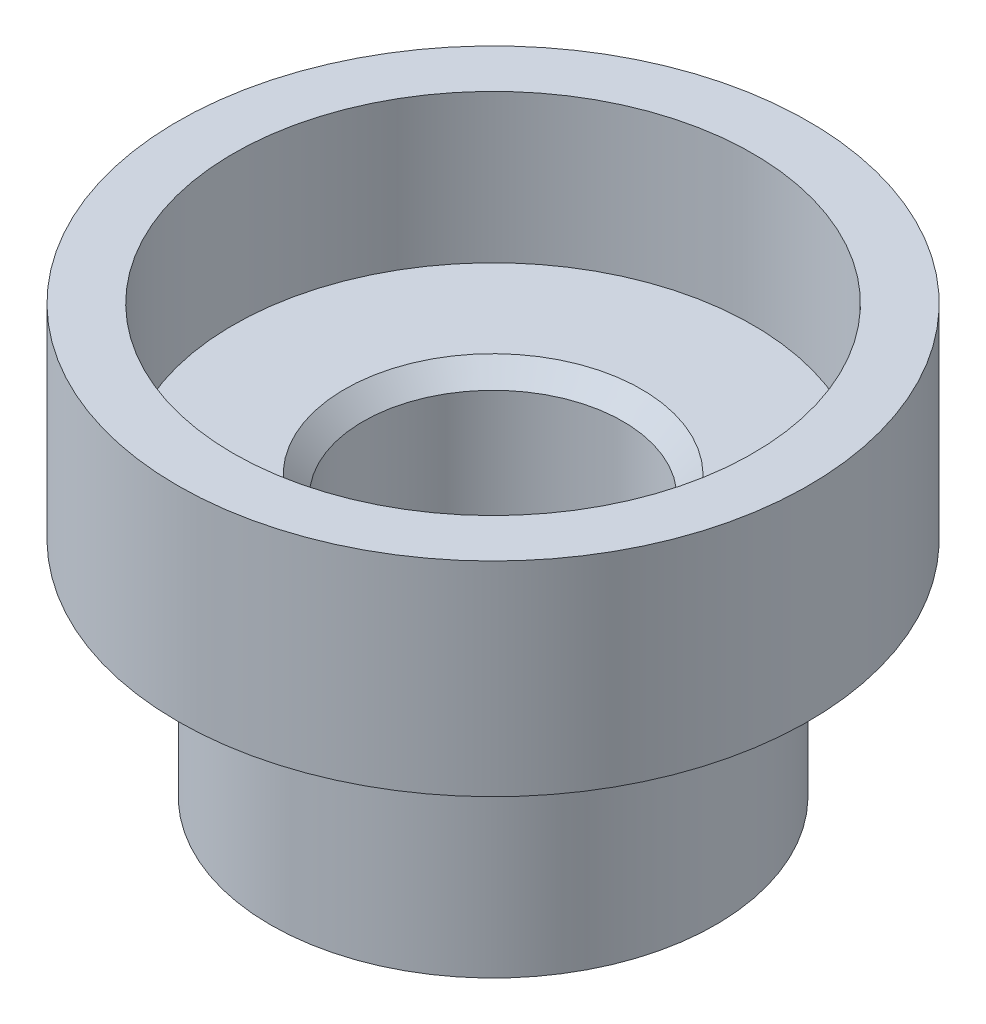
ISO-10303-21;
HEADER;
FILE_DESCRIPTION(('STEP AP214'),'2;1');
FILE_NAME('part.step','',(''),(''),'','','');
FILE_SCHEMA(('AUTOMOTIVE_DESIGN { 1 0 10303 214 1 1 1 1 }'));
ENDSEC;
DATA;
#1=APPLICATION_CONTEXT('core data for automotive mechanical design processes');
#2=APPLICATION_PROTOCOL_DEFINITION('international standard','automotive_design',2000,#1);
#3=PRODUCT_CONTEXT('',#1,'mechanical');
#4=PRODUCT('Part','Part','',(#3));
#5=PRODUCT_RELATED_PRODUCT_CATEGORY('part','',(#4));
#6=PRODUCT_DEFINITION_FORMATION('','',#4);
#7=PRODUCT_DEFINITION_CONTEXT('part definition',#1,'design');
#8=PRODUCT_DEFINITION('design','',#6,#7);
#9=PRODUCT_DEFINITION_SHAPE('','',#8);
#10=(LENGTH_UNIT() NAMED_UNIT(*) SI_UNIT(.MILLI.,.METRE.));
#11=(NAMED_UNIT(*) PLANE_ANGLE_UNIT() SI_UNIT($,.RADIAN.));
#12=(NAMED_UNIT(*) SI_UNIT($,.STERADIAN.) SOLID_ANGLE_UNIT());
#13=UNCERTAINTY_MEASURE_WITH_UNIT(LENGTH_MEASURE(1.E-05),#10,'distance_accuracy_value','');
#14=(GEOMETRIC_REPRESENTATION_CONTEXT(3) GLOBAL_UNCERTAINTY_ASSIGNED_CONTEXT((#13)) GLOBAL_UNIT_ASSIGNED_CONTEXT((#10,
#11,#12)) REPRESENTATION_CONTEXT('',''));
#15=CARTESIAN_POINT('',(0.,0.,0.));
#16=DIRECTION('',(0.,0.,1.));
#17=DIRECTION('',(1.,0.,0.));
#18=AXIS2_PLACEMENT_3D('',#15,#16,#17);
#19=CARTESIAN_POINT('',(0.,-4.6,0.));
#20=DIRECTION('',(0.,1.,0.));
#21=DIRECTION('',(0.,0.,1.));
#22=AXIS2_PLACEMENT_3D('',#19,#20,#21);
#23=CYLINDRICAL_SURFACE('',#22,2.4);
#24=CARTESIAN_POINT('',(0.,-4.6,0.));
#25=DIRECTION('',(0.,1.,0.));
#26=DIRECTION('',(0.,0.,1.));
#27=AXIS2_PLACEMENT_3D('',#24,#25,#26);
#28=CIRCLE('',#27,2.4);
#29=CARTESIAN_POINT('',(0.,-4.6,2.4));
#30=VERTEX_POINT('',#29);
#31=EDGE_CURVE('E85',#30,#30,#28,.T.);
#32=ORIENTED_EDGE('',*,*,#31,.T.);
#33=EDGE_LOOP('',(#32));
#34=FACE_BOUND('',#33,.T.);
#35=CARTESIAN_POINT('',(0.,-2.4,0.));
#36=DIRECTION('',(0.,1.,0.));
#37=DIRECTION('',(0.,0.,1.));
#38=AXIS2_PLACEMENT_3D('',#35,#36,#37);
#39=CIRCLE('',#38,2.4);
#40=CARTESIAN_POINT('',(0.,-2.4,2.4));
#41=VERTEX_POINT('',#40);
#42=EDGE_CURVE('E10',#41,#41,#39,.T.);
#43=ORIENTED_EDGE('',*,*,#42,.F.);
#44=EDGE_LOOP('',(#43));
#45=FACE_BOUND('',#44,.T.);
#46=ADVANCED_FACE('F40',(#34,#45),#23,.T.);
#47=CARTESIAN_POINT('',(0.,-2.4,0.));
#48=DIRECTION('',(0.,1.,0.));
#49=DIRECTION('',(0.,0.,1.));
#50=AXIS2_PLACEMENT_3D('',#47,#48,#49);
#51=TOROIDAL_SURFACE('',#50,2.6,0.2);
#52=ORIENTED_EDGE('',*,*,#42,.T.);
#53=EDGE_LOOP('',(#52));
#54=FACE_BOUND('',#53,.T.);
#55=CARTESIAN_POINT('',(0.,-2.2,0.));
#56=DIRECTION('',(0.,1.,0.));
#57=DIRECTION('',(0.,0.,1.));
#58=AXIS2_PLACEMENT_3D('',#55,#56,#57);
#59=CIRCLE('',#58,2.6);
#60=CARTESIAN_POINT('',(0.,-2.2,2.6));
#61=VERTEX_POINT('',#60);
#62=EDGE_CURVE('E47',#61,#61,#59,.T.);
#63=ORIENTED_EDGE('',*,*,#62,.F.);
#64=EDGE_LOOP('',(#63));
#65=FACE_BOUND('',#64,.T.);
#66=ADVANCED_FACE('F105',(#54,#65),#51,.F.);
#67=CARTESIAN_POINT('',(3.4,-2.2,0.));
#68=DIRECTION('',(0.,-1.,0.));
#69=DIRECTION('',(0.,0.,-1.));
#70=AXIS2_PLACEMENT_3D('',#67,#68,#69);
#71=PLANE('',#70);
#72=ORIENTED_EDGE('',*,*,#62,.T.);
#73=EDGE_LOOP('',(#72));
#74=FACE_BOUND('',#73,.T.);
#75=CARTESIAN_POINT('',(0.,-2.2,0.));
#76=DIRECTION('',(0.,1.,0.));
#77=DIRECTION('',(0.,0.,1.));
#78=AXIS2_PLACEMENT_3D('',#75,#76,#77);
#79=CIRCLE('',#78,3.4);
#80=CARTESIAN_POINT('',(0.,-2.2,3.4));
#81=VERTEX_POINT('',#80);
#82=EDGE_CURVE('E55',#81,#81,#79,.T.);
#83=ORIENTED_EDGE('',*,*,#82,.F.);
#84=EDGE_LOOP('',(#83));
#85=FACE_BOUND('',#84,.T.);
#86=ADVANCED_FACE('F109',(#74,#85),#71,.T.);
#87=CARTESIAN_POINT('',(0.,-4.6,0.));
#88=DIRECTION('',(0.,1.,0.));
#89=DIRECTION('',(0.,0.,1.));
#90=AXIS2_PLACEMENT_3D('',#87,#88,#89);
#91=CYLINDRICAL_SURFACE('',#90,3.4);
#92=ORIENTED_EDGE('',*,*,#82,.T.);
#93=EDGE_LOOP('',(#92));
#94=FACE_BOUND('',#93,.T.);
#95=CARTESIAN_POINT('',(0.,0.,0.));
#96=DIRECTION('',(0.,1.,0.));
#97=DIRECTION('',(0.,0.,1.));
#98=AXIS2_PLACEMENT_3D('',#95,#96,#97);
#99=CIRCLE('',#98,3.4);
#100=CARTESIAN_POINT('',(0.,0.,3.4));
#101=VERTEX_POINT('',#100);
#102=EDGE_CURVE('E62',#101,#101,#99,.T.);
#103=ORIENTED_EDGE('',*,*,#102,.F.);
#104=EDGE_LOOP('',(#103));
#105=FACE_BOUND('',#104,.T.);
#106=ADVANCED_FACE('F113',(#94,#105),#91,.T.);
#107=CARTESIAN_POINT('',(2.8,0.,0.));
#108=DIRECTION('',(0.,1.,0.));
#109=DIRECTION('',(0.,0.,1.));
#110=AXIS2_PLACEMENT_3D('',#107,#108,#109);
#111=PLANE('',#110);
#112=ORIENTED_EDGE('',*,*,#102,.T.);
#113=EDGE_LOOP('',(#112));
#114=FACE_BOUND('',#113,.T.);
#115=CARTESIAN_POINT('',(0.,0.,0.));
#116=DIRECTION('',(0.,1.,0.));
#117=DIRECTION('',(0.,0.,1.));
#118=AXIS2_PLACEMENT_3D('',#115,#116,#117);
#119=CIRCLE('',#118,2.8);
#120=CARTESIAN_POINT('',(0.,0.,2.8));
#121=VERTEX_POINT('',#120);
#122=EDGE_CURVE('E68',#121,#121,#119,.T.);
#123=ORIENTED_EDGE('',*,*,#122,.F.);
#124=EDGE_LOOP('',(#123));
#125=FACE_BOUND('',#124,.T.);
#126=ADVANCED_FACE('F119',(#114,#125),#111,.T.);
#127=CARTESIAN_POINT('',(0.,-4.6,0.));
#128=DIRECTION('',(0.,1.,0.));
#129=DIRECTION('',(0.,0.,1.));
#130=AXIS2_PLACEMENT_3D('',#127,#128,#129);
#131=CYLINDRICAL_SURFACE('',#130,2.8);
#132=ORIENTED_EDGE('',*,*,#122,.T.);
#133=EDGE_LOOP('',(#132));
#134=FACE_BOUND('',#133,.T.);
#135=CARTESIAN_POINT('',(0.,-1.6,0.));
#136=DIRECTION('',(0.,1.,0.));
#137=DIRECTION('',(0.,0.,1.));
#138=AXIS2_PLACEMENT_3D('',#135,#136,#137);
#139=CIRCLE('',#138,2.8);
#140=CARTESIAN_POINT('',(0.,-1.6,2.8));
#141=VERTEX_POINT('',#140);
#142=EDGE_CURVE('E72',#141,#141,#139,.T.);
#143=ORIENTED_EDGE('',*,*,#142,.F.);
#144=EDGE_LOOP('',(#143));
#145=FACE_BOUND('',#144,.T.);
#146=ADVANCED_FACE('F123',(#134,#145),#131,.F.);
#147=CARTESIAN_POINT('',(1.59999999999627,-1.6,0.));
#148=DIRECTION('',(0.,1.,0.));
#149=DIRECTION('',(0.,0.,1.));
#150=AXIS2_PLACEMENT_3D('',#147,#148,#149);
#151=PLANE('',#150);
#152=ORIENTED_EDGE('',*,*,#142,.T.);
#153=EDGE_LOOP('',(#152));
#154=FACE_BOUND('',#153,.T.);
#155=CARTESIAN_POINT('',(0.,-1.6,0.));
#156=DIRECTION('',(0.,1.,0.));
#157=DIRECTION('',(0.,0.,1.));
#158=AXIS2_PLACEMENT_3D('',#155,#156,#157);
#159=CIRCLE('',#158,1.59999999999627);
#160=CARTESIAN_POINT('',(0.,-1.6,1.59999999999627));
#161=VERTEX_POINT('',#160);
#162=EDGE_CURVE('E76',#161,#161,#159,.T.);
#163=ORIENTED_EDGE('',*,*,#162,.F.);
#164=EDGE_LOOP('',(#163));
#165=FACE_BOUND('',#164,.T.);
#166=ADVANCED_FACE('F127',(#154,#165),#151,.T.);
#167=CARTESIAN_POINT('',(0.,-1.80000000000664,0.));
#168=DIRECTION('',(0.,1.,0.));
#169=DIRECTION('',(0.,0.,1.));
#170=AXIS2_PLACEMENT_3D('',#167,#168,#169);
#171=CONICAL_SURFACE('',#170,1.39999999998963,0.785398163397448);
#172=ORIENTED_EDGE('',*,*,#162,.T.);
#173=EDGE_LOOP('',(#172));
#174=FACE_BOUND('',#173,.T.);
#175=CARTESIAN_POINT('',(0.,-1.80000000000664,0.));
#176=DIRECTION('',(0.,1.,0.));
#177=DIRECTION('',(0.,0.,1.));
#178=AXIS2_PLACEMENT_3D('',#175,#176,#177);
#179=CIRCLE('',#178,1.39999999998963);
#180=CARTESIAN_POINT('',(0.,-1.80000000000664,1.39999999998963));
#181=VERTEX_POINT('',#180);
#182=EDGE_CURVE('E79',#181,#181,#179,.T.);
#183=ORIENTED_EDGE('',*,*,#182,.F.);
#184=EDGE_LOOP('',(#183));
#185=FACE_BOUND('',#184,.T.);
#186=ADVANCED_FACE('F101',(#174,#185),#171,.F.);
#187=CARTESIAN_POINT('',(0.,-4.6,0.));
#188=DIRECTION('',(0.,1.,0.));
#189=DIRECTION('',(0.,0.,1.));
#190=AXIS2_PLACEMENT_3D('',#187,#188,#189);
#191=CYLINDRICAL_SURFACE('',#190,1.39999999998963);
#192=ORIENTED_EDGE('',*,*,#182,.T.);
#193=EDGE_LOOP('',(#192));
#194=FACE_BOUND('',#193,.T.);
#195=CARTESIAN_POINT('',(0.,-4.6,0.));
#196=DIRECTION('',(0.,1.,0.));
#197=DIRECTION('',(0.,0.,1.));
#198=AXIS2_PLACEMENT_3D('',#195,#196,#197);
#199=CIRCLE('',#198,1.39999999998963);
#200=CARTESIAN_POINT('',(0.,-4.6,1.39999999998963));
#201=VERTEX_POINT('',#200);
#202=EDGE_CURVE('E82',#201,#201,#199,.T.);
#203=ORIENTED_EDGE('',*,*,#202,.F.);
#204=EDGE_LOOP('',(#203));
#205=FACE_BOUND('',#204,.T.);
#206=ADVANCED_FACE('F95',(#194,#205),#191,.F.);
#207=CARTESIAN_POINT('',(2.4,-4.6,0.));
#208=DIRECTION('',(0.,-1.,0.));
#209=DIRECTION('',(0.,0.,-1.));
#210=AXIS2_PLACEMENT_3D('',#207,#208,#209);
#211=PLANE('',#210);
#212=ORIENTED_EDGE('',*,*,#202,.T.);
#213=EDGE_LOOP('',(#212));
#214=FACE_BOUND('',#213,.T.);
#215=ORIENTED_EDGE('',*,*,#31,.F.);
#216=EDGE_LOOP('',(#215));
#217=FACE_BOUND('',#216,.T.);
#218=ADVANCED_FACE('F93',(#214,#217),#211,.T.);
#219=CLOSED_SHELL('',(#46,#66,#86,#106,#126,#146,#166,#186,#206,#218));
#220=MANIFOLD_SOLID_BREP('B2',#219);
#221=ADVANCED_BREP_SHAPE_REPRESENTATION('',(#18,#220),#14);
#222=SHAPE_DEFINITION_REPRESENTATION(#9,#221);
ENDSEC;
END-ISO-10303-21;
